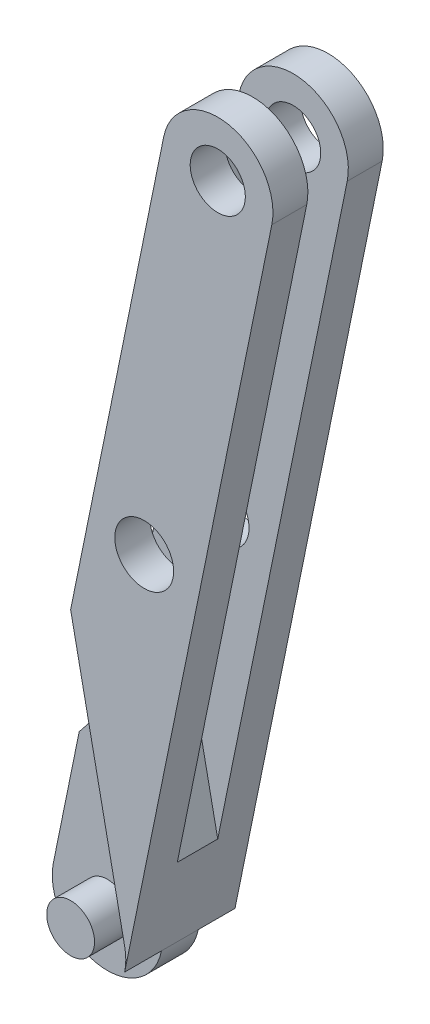
ISO-10303-21;
HEADER;
FILE_DESCRIPTION(('STEP AP214'),'2;1');
FILE_NAME('part.step','',(''),(''),'','','');
FILE_SCHEMA(('AUTOMOTIVE_DESIGN { 1 0 10303 214 1 1 1 1 }'));
ENDSEC;
DATA;
#1=APPLICATION_CONTEXT('core data for automotive mechanical design processes');
#2=APPLICATION_PROTOCOL_DEFINITION('international standard','automotive_design',2000,#1);
#3=PRODUCT_CONTEXT('',#1,'mechanical');
#4=PRODUCT('Part','Part','',(#3));
#5=PRODUCT_RELATED_PRODUCT_CATEGORY('part','',(#4));
#6=PRODUCT_DEFINITION_FORMATION('','',#4);
#7=PRODUCT_DEFINITION_CONTEXT('part definition',#1,'design');
#8=PRODUCT_DEFINITION('design','',#6,#7);
#9=PRODUCT_DEFINITION_SHAPE('','',#8);
#10=(LENGTH_UNIT() NAMED_UNIT(*) SI_UNIT(.MILLI.,.METRE.));
#11=(NAMED_UNIT(*) PLANE_ANGLE_UNIT() SI_UNIT($,.RADIAN.));
#12=(NAMED_UNIT(*) SI_UNIT($,.STERADIAN.) SOLID_ANGLE_UNIT());
#13=UNCERTAINTY_MEASURE_WITH_UNIT(LENGTH_MEASURE(1.E-05),#10,'distance_accuracy_value','');
#14=(GEOMETRIC_REPRESENTATION_CONTEXT(3) GLOBAL_UNCERTAINTY_ASSIGNED_CONTEXT((#13)) GLOBAL_UNIT_ASSIGNED_CONTEXT((#10,
#11,#12)) REPRESENTATION_CONTEXT('',''));
#15=CARTESIAN_POINT('',(0.,0.,0.));
#16=DIRECTION('',(0.,0.,1.));
#17=DIRECTION('',(1.,0.,0.));
#18=AXIS2_PLACEMENT_3D('',#15,#16,#17);
#19=CARTESIAN_POINT('',(5.38354803407322,-0.315439388996806,5.25));
#20=DIRECTION('',(0.979795897113344,-0.199999999999644,0.));
#21=DIRECTION('',(-0.199999999999644,-0.979795897113344,0.));
#22=AXIS2_PLACEMENT_3D('',#19,#20,#21);
#23=PLANE('',#22);
#24=DIRECTION('',(0.,0.,-1.));
#25=VECTOR('',#24,1.);
#26=CARTESIAN_POINT('',(-1.61645196591433,-34.6082957879639,5.25));
#27=LINE('',#26,#25);
#28=CARTESIAN_POINT('',(-1.61645196591434,-34.6082957879638,1.75));
#29=VERTEX_POINT('',#28);
#30=CARTESIAN_POINT('',(-1.61645196591434,-34.6082957879638,-1.75));
#31=VERTEX_POINT('',#30);
#32=EDGE_CURVE('E358',#29,#31,#27,.T.);
#33=ORIENTED_EDGE('',*,*,#32,.T.);
#34=DIRECTION('',(0.,0.,1.));
#35=VECTOR('',#34,1.);
#36=CARTESIAN_POINT('',(-1.61645196591433,-34.6082957879639,-5.25));
#37=LINE('',#36,#35);
#38=CARTESIAN_POINT('',(-1.61645196591433,-34.6082957879639,-5.25));
#39=VERTEX_POINT('',#38);
#40=EDGE_CURVE('E265',#39,#31,#37,.T.);
#41=ORIENTED_EDGE('',*,*,#40,.F.);
#42=DIRECTION('',(0.199999999999644,0.979795897113344,0.));
#43=VECTOR('',#42,1.);
#44=CARTESIAN_POINT('',(5.38354803407322,-0.315439388996806,-5.25));
#45=LINE('',#44,#43);
#46=CARTESIAN_POINT('',(12.3835480340608,33.9774170099702,-5.25));
#47=VERTEX_POINT('',#46);
#48=EDGE_CURVE('E259',#39,#47,#45,.T.);
#49=ORIENTED_EDGE('',*,*,#48,.T.);
#50=DIRECTION('',(0.,0.,1.));
#51=VECTOR('',#50,1.);
#52=CARTESIAN_POINT('',(12.3835480340608,33.9774170099702,-5.25));
#53=LINE('',#52,#51);
#54=CARTESIAN_POINT('',(12.3835480340608,33.9774170099702,-1.925));
#55=VERTEX_POINT('',#54);
#56=EDGE_CURVE('E268',#47,#55,#53,.T.);
#57=ORIENTED_EDGE('',*,*,#56,.T.);
#58=DIRECTION('',(-0.199999999999644,-0.979795897113344,0.));
#59=VECTOR('',#58,1.);
#60=CARTESIAN_POINT('',(5.38354803407322,-0.315439388996806,-1.925));
#61=LINE('',#60,#59);
#62=CARTESIAN_POINT('',(0.0610109471600804,-26.3904393889987,-1.925));
#63=VERTEX_POINT('',#62);
#64=EDGE_CURVE('E232',#55,#63,#61,.T.);
#65=ORIENTED_EDGE('',*,*,#64,.T.);
#66=DIRECTION('',(0.,0.,-1.));
#67=VECTOR('',#66,1.);
#68=CARTESIAN_POINT('',(0.0610109471600792,-26.3904393889987,5.25));
#69=LINE('',#68,#67);
#70=CARTESIAN_POINT('',(0.0610109471600804,-26.3904393889987,1.925));
#71=VERTEX_POINT('',#70);
#72=EDGE_CURVE('E313',#71,#63,#69,.T.);
#73=ORIENTED_EDGE('',*,*,#72,.F.);
#74=DIRECTION('',(-0.199999999999644,-0.979795897113344,0.));
#75=VECTOR('',#74,1.);
#76=CARTESIAN_POINT('',(5.38354803407322,-0.315439388996806,1.925));
#77=LINE('',#76,#75);
#78=CARTESIAN_POINT('',(12.3835480340608,33.9774170099702,1.925));
#79=VERTEX_POINT('',#78);
#80=EDGE_CURVE('E323',#79,#71,#77,.T.);
#81=ORIENTED_EDGE('',*,*,#80,.F.);
#82=DIRECTION('',(0.,0.,-1.));
#83=VECTOR('',#82,1.);
#84=CARTESIAN_POINT('',(12.3835480340608,33.9774170099702,5.25));
#85=LINE('',#84,#83);
#86=CARTESIAN_POINT('',(12.3835480340608,33.9774170099702,5.25));
#87=VERTEX_POINT('',#86);
#88=EDGE_CURVE('E360',#87,#79,#85,.T.);
#89=ORIENTED_EDGE('',*,*,#88,.F.);
#90=DIRECTION('',(0.199999999999644,0.979795897113344,0.));
#91=VECTOR('',#90,1.);
#92=CARTESIAN_POINT('',(5.38354803407322,-0.315439388996806,5.25));
#93=LINE('',#92,#91);
#94=CARTESIAN_POINT('',(-1.61645196591433,-34.6082957879639,5.25));
#95=VERTEX_POINT('',#94);
#96=EDGE_CURVE('E351',#95,#87,#93,.T.);
#97=ORIENTED_EDGE('',*,*,#96,.F.);
#98=EDGE_CURVE('E67',#95,#29,#27,.T.);
#99=ORIENTED_EDGE('',*,*,#98,.T.);
#100=EDGE_LOOP('',(#33,#41,#49,#57,#65,#73,#81,#89,#97,#99));
#101=FACE_BOUND('',#100,.T.);
#102=ADVANCED_FACE('F44',(#101),#23,.T.);
#103=CARTESIAN_POINT('',(-4.90430888561689,1.78456061099946,5.25));
#104=DIRECTION('',(0.979795897113344,-0.199999999999644,0.));
#105=DIRECTION('',(-0.199999999999644,-0.979795897113344,0.));
#106=AXIS2_PLACEMENT_3D('',#103,#104,#105);
#107=PLANE('',#106);
#108=DIRECTION('',(0.,0.,-1.));
#109=VECTOR('',#108,1.);
#110=CARTESIAN_POINT('',(2.09569111437066,36.0774170099665,5.25));
#111=LINE('',#110,#109);
#112=CARTESIAN_POINT('',(2.09569111437067,36.0774170099665,1.925));
#113=VERTEX_POINT('',#112);
#114=CARTESIAN_POINT('',(2.09569111437067,36.0774170099665,-1.925));
#115=VERTEX_POINT('',#114);
#116=EDGE_CURVE('E363',#113,#115,#111,.T.);
#117=ORIENTED_EDGE('',*,*,#116,.T.);
#118=DIRECTION('',(0.,0.,1.));
#119=VECTOR('',#118,1.);
#120=CARTESIAN_POINT('',(2.09569111437066,36.0774170099665,-5.25));
#121=LINE('',#120,#119);
#122=CARTESIAN_POINT('',(2.09569111437066,36.0774170099665,-5.25));
#123=VERTEX_POINT('',#122);
#124=EDGE_CURVE('E271',#123,#115,#121,.T.);
#125=ORIENTED_EDGE('',*,*,#124,.F.);
#126=DIRECTION('',(0.199999999999644,0.979795897113344,0.));
#127=VECTOR('',#126,1.);
#128=CARTESIAN_POINT('',(-4.90430888561689,1.78456061099946,-5.25));
#129=LINE('',#128,#127);
#130=CARTESIAN_POINT('',(-6.7603804257689,-7.30829578796575,-5.25));
#131=VERTEX_POINT('',#130);
#132=EDGE_CURVE('E254',#131,#123,#129,.T.);
#133=ORIENTED_EDGE('',*,*,#132,.F.);
#134=DIRECTION('',(0.,0.,-1.));
#135=VECTOR('',#134,1.);
#136=CARTESIAN_POINT('',(-6.7603804257689,-7.30829578796575,-1.75));
#137=LINE('',#136,#135);
#138=CARTESIAN_POINT('',(-6.76038042576892,-7.30829578796575,-1.925));
#139=VERTEX_POINT('',#138);
#140=EDGE_CURVE('E248',#139,#131,#137,.T.);
#141=ORIENTED_EDGE('',*,*,#140,.F.);
#142=DIRECTION('',(-0.199999999999644,-0.979795897113344,0.));
#143=VECTOR('',#142,1.);
#144=CARTESIAN_POINT('',(-4.90430888561689,1.78456061099946,-1.925));
#145=LINE('',#144,#143);
#146=CARTESIAN_POINT('',(0.418228201296263,27.8595606110014,-1.925));
#147=VERTEX_POINT('',#146);
#148=EDGE_CURVE('E213',#147,#139,#145,.T.);
#149=ORIENTED_EDGE('',*,*,#148,.F.);
#150=DIRECTION('',(0.,0.,1.));
#151=VECTOR('',#150,1.);
#152=CARTESIAN_POINT('',(0.418228201296265,27.8595606110014,5.25));
#153=LINE('',#152,#151);
#154=CARTESIAN_POINT('',(0.418228201296263,27.8595606110014,1.925));
#155=VERTEX_POINT('',#154);
#156=EDGE_CURVE('E367',#147,#155,#153,.T.);
#157=ORIENTED_EDGE('',*,*,#156,.T.);
#158=DIRECTION('',(-0.199999999999644,-0.979795897113344,0.));
#159=VECTOR('',#158,1.);
#160=CARTESIAN_POINT('',(-4.90430888561689,1.78456061099946,1.925));
#161=LINE('',#160,#159);
#162=CARTESIAN_POINT('',(-6.76038042576892,-7.30829578796575,1.925));
#163=VERTEX_POINT('',#162);
#164=EDGE_CURVE('E311',#155,#163,#161,.T.);
#165=ORIENTED_EDGE('',*,*,#164,.T.);
#166=DIRECTION('',(0.,0.,1.));
#167=VECTOR('',#166,1.);
#168=CARTESIAN_POINT('',(-6.7603804257689,-7.30829578796575,1.75));
#169=LINE('',#168,#167);
#170=CARTESIAN_POINT('',(-6.7603804257689,-7.30829578796575,5.25));
#171=VERTEX_POINT('',#170);
#172=EDGE_CURVE('E340',#163,#171,#169,.T.);
#173=ORIENTED_EDGE('',*,*,#172,.T.);
#174=DIRECTION('',(0.199999999999644,0.979795897113344,0.));
#175=VECTOR('',#174,1.);
#176=CARTESIAN_POINT('',(-4.90430888561689,1.78456061099946,5.25));
#177=LINE('',#176,#175);
#178=CARTESIAN_POINT('',(2.09569111437066,36.0774170099665,5.25));
#179=VERTEX_POINT('',#178);
#180=EDGE_CURVE('E346',#171,#179,#177,.T.);
#181=ORIENTED_EDGE('',*,*,#180,.T.);
#182=EDGE_CURVE('E364',#179,#113,#111,.T.);
#183=ORIENTED_EDGE('',*,*,#182,.T.);
#184=EDGE_LOOP('',(#117,#125,#133,#141,#149,#157,#165,#173,#181,#183));
#185=FACE_BOUND('',#184,.T.);
#186=ADVANCED_FACE('F398',(#185),#107,.F.);
#187=CARTESIAN_POINT('',(-6.76038042575937,-33.5582957879657,5.25));
#188=DIRECTION('',(0.,0.,-1.));
#189=DIRECTION('',(-1.,-3.63042929052426E-13,0.));
#190=AXIS2_PLACEMENT_3D('',#187,#188,#189);
#191=CYLINDRICAL_SURFACE('',#190,2.275);
#192=CARTESIAN_POINT('',(-6.76038042575937,-33.5582957879657,1.75));
#193=DIRECTION('',(0.,0.,1.));
#194=DIRECTION('',(1.,3.63042929052426E-13,0.));
#195=AXIS2_PLACEMENT_3D('',#192,#193,#194);
#196=CIRCLE('',#195,2.275);
#197=CARTESIAN_POINT('',(-4.48538042575937,-33.5582957879649,1.75));
#198=VERTEX_POINT('',#197);
#199=EDGE_CURVE('E48',#198,#198,#196,.T.);
#200=ORIENTED_EDGE('',*,*,#199,.T.);
#201=EDGE_LOOP('',(#200));
#202=FACE_BOUND('',#201,.T.);
#203=CARTESIAN_POINT('',(-6.76038042575937,-33.5582957879657,5.25));
#204=DIRECTION('',(0.,0.,1.));
#205=DIRECTION('',(1.,3.63042929052426E-13,0.));
#206=AXIS2_PLACEMENT_3D('',#203,#204,#205);
#207=CIRCLE('',#206,2.275);
#208=CARTESIAN_POINT('',(-4.48538042575937,-33.5582957879649,5.25));
#209=VERTEX_POINT('',#208);
#210=EDGE_CURVE('E11',#209,#209,#207,.T.);
#211=ORIENTED_EDGE('',*,*,#210,.F.);
#212=EDGE_LOOP('',(#211));
#213=FACE_BOUND('',#212,.T.);
#214=ADVANCED_FACE('F376',(#202,#213),#191,.T.);
#215=CARTESIAN_POINT('',(-6.76038042575937,-33.5582957879657,5.25));
#216=DIRECTION('',(0.,0.,1.));
#217=DIRECTION('',(1.,3.63042929052426E-13,0.));
#218=AXIS2_PLACEMENT_3D('',#215,#216,#217);
#219=PLANE('',#218);
#220=ORIENTED_EDGE('',*,*,#210,.T.);
#221=EDGE_LOOP('',(#220));
#222=FACE_BOUND('',#221,.T.);
#223=ADVANCED_FACE('F46',(#222),#219,.T.);
#224=DIRECTION('',(0.,0.,-1.));
#225=VECTOR('',#224,1.);
#226=CARTESIAN_POINT('',(-9.44491534483747,-20.4597772847935,5.25));
#227=LINE('',#226,#225);
#228=CARTESIAN_POINT('',(-9.44491534483748,-20.4597772847935,1.75));
#229=VERTEX_POINT('',#228);
#230=CARTESIAN_POINT('',(-9.44491534483748,-20.4597772847935,-1.75));
#231=VERTEX_POINT('',#230);
#232=EDGE_CURVE('E295',#229,#231,#227,.T.);
#233=ORIENTED_EDGE('',*,*,#232,.T.);
#234=DIRECTION('',(0.199999999999646,0.979795897113344,0.));
#235=VECTOR('',#234,1.);
#236=CARTESIAN_POINT('',(-4.90430888561686,1.78456061099946,-1.75));
#237=LINE('',#236,#235);
#238=CARTESIAN_POINT('',(-11.9043088856044,-32.5082957879676,-1.75));
#239=VERTEX_POINT('',#238);
#240=EDGE_CURVE('E236',#239,#231,#237,.T.);
#241=ORIENTED_EDGE('',*,*,#240,.F.);
#242=DIRECTION('',(0.,0.,-1.));
#243=VECTOR('',#242,1.);
#244=CARTESIAN_POINT('',(-11.9043088856044,-32.5082957879676,5.25));
#245=LINE('',#244,#243);
#246=CARTESIAN_POINT('',(-11.9043088856044,-32.5082957879676,1.75));
#247=VERTEX_POINT('',#246);
#248=EDGE_CURVE('E356',#247,#239,#245,.T.);
#249=ORIENTED_EDGE('',*,*,#248,.F.);
#250=DIRECTION('',(0.199999999999646,0.979795897113344,0.));
#251=VECTOR('',#250,1.);
#252=CARTESIAN_POINT('',(-4.90430888561686,1.78456061099946,1.75));
#253=LINE('',#252,#251);
#254=EDGE_CURVE('E326',#247,#229,#253,.T.);
#255=ORIENTED_EDGE('',*,*,#254,.T.);
#256=EDGE_LOOP('',(#233,#241,#249,#255));
#257=FACE_BOUND('',#256,.T.);
#258=ADVANCED_FACE('F405',(#257),#107,.F.);
#259=CARTESIAN_POINT('',(-6.76038042575937,-33.5582957879657,5.25));
#260=DIRECTION('',(0.,0.,-1.));
#261=DIRECTION('',(1.,3.63042929052426E-13,0.));
#262=AXIS2_PLACEMENT_3D('',#259,#260,#261);
#263=CYLINDRICAL_SURFACE('',#262,5.25);
#264=ORIENTED_EDGE('',*,*,#248,.T.);
#265=CARTESIAN_POINT('',(-6.76038042575938,-33.5582957879657,-1.75));
#266=DIRECTION('',(0.,0.,1.));
#267=DIRECTION('',(1.,3.63042929052426E-13,0.));
#268=AXIS2_PLACEMENT_3D('',#265,#266,#267);
#269=CIRCLE('',#268,5.24999999999999);
#270=EDGE_CURVE('E239',#31,#239,#269,.F.);
#271=ORIENTED_EDGE('',*,*,#270,.F.);
#272=ORIENTED_EDGE('',*,*,#32,.F.);
#273=CARTESIAN_POINT('',(-6.76038042575938,-33.5582957879657,1.75));
#274=DIRECTION('',(0.,0.,1.));
#275=DIRECTION('',(1.,3.63042929052426E-13,0.));
#276=AXIS2_PLACEMENT_3D('',#273,#274,#275);
#277=CIRCLE('',#276,5.24999999999999);
#278=EDGE_CURVE('E329',#29,#247,#277,.F.);
#279=ORIENTED_EDGE('',*,*,#278,.T.);
#280=EDGE_LOOP('',(#264,#271,#272,#279));
#281=FACE_BOUND('',#280,.T.);
#282=ADVANCED_FACE('F408',(#281),#263,.T.);
#283=CARTESIAN_POINT('',(7.23961957421572,35.0274170099684,5.25));
#284=DIRECTION('',(0.,0.,-1.));
#285=DIRECTION('',(1.,3.63042929052426E-13,0.));
#286=AXIS2_PLACEMENT_3D('',#283,#284,#285);
#287=CYLINDRICAL_SURFACE('',#286,5.25);
#288=ORIENTED_EDGE('',*,*,#88,.T.);
#289=CARTESIAN_POINT('',(7.23961957421572,35.0274170099684,1.925));
#290=DIRECTION('',(0.,0.,1.));
#291=DIRECTION('',(1.,3.63042929052426E-13,0.));
#292=AXIS2_PLACEMENT_3D('',#289,#290,#291);
#293=CIRCLE('',#292,5.25);
#294=EDGE_CURVE('E59',#113,#79,#293,.F.);
#295=ORIENTED_EDGE('',*,*,#294,.F.);
#296=ORIENTED_EDGE('',*,*,#182,.F.);
#297=CARTESIAN_POINT('',(7.23961957421572,35.0274170099684,5.25));
#298=DIRECTION('',(0.,0.,-1.));
#299=DIRECTION('',(-1.,-3.63042929052426E-13,0.));
#300=AXIS2_PLACEMENT_3D('',#297,#298,#299);
#301=CIRCLE('',#300,5.25);
#302=EDGE_CURVE('E348',#179,#87,#301,.T.);
#303=ORIENTED_EDGE('',*,*,#302,.T.);
#304=EDGE_LOOP('',(#288,#295,#296,#303));
#305=FACE_BOUND('',#304,.T.);
#306=ADVANCED_FACE('F410',(#305),#287,.T.);
#307=CARTESIAN_POINT('',(0.239619574228164,0.734560611001335,5.25));
#308=DIRECTION('',(0.,0.,-1.));
#309=DIRECTION('',(1.,3.63042929052426E-13,0.));
#310=AXIS2_PLACEMENT_3D('',#307,#308,#309);
#311=CYLINDRICAL_SURFACE('',#310,2.8);
#312=CARTESIAN_POINT('',(0.239619574228164,0.734560611001335,1.925));
#313=DIRECTION('',(0.,0.,1.));
#314=DIRECTION('',(1.,3.63042929052426E-13,0.));
#315=AXIS2_PLACEMENT_3D('',#312,#313,#314);
#316=CIRCLE('',#315,2.8);
#317=CARTESIAN_POINT('',(3.03961957422816,0.734560611002351,1.925));
#318=VERTEX_POINT('',#317);
#319=EDGE_CURVE('E310',#318,#318,#316,.T.);
#320=ORIENTED_EDGE('',*,*,#319,.F.);
#321=EDGE_LOOP('',(#320));
#322=FACE_BOUND('',#321,.T.);
#323=CARTESIAN_POINT('',(0.239619574228164,0.734560611001335,5.25));
#324=DIRECTION('',(0.,0.,-1.));
#325=DIRECTION('',(-1.,-3.63042929052426E-13,0.));
#326=AXIS2_PLACEMENT_3D('',#323,#324,#325);
#327=CIRCLE('',#326,2.8);
#328=CARTESIAN_POINT('',(-2.56038042577184,0.734560611000318,5.25));
#329=VERTEX_POINT('',#328);
#330=EDGE_CURVE('E353',#329,#329,#327,.T.);
#331=ORIENTED_EDGE('',*,*,#330,.F.);
#332=EDGE_LOOP('',(#331));
#333=FACE_BOUND('',#332,.T.);
#334=ADVANCED_FACE('F412',(#322,#333),#311,.F.);
#335=CARTESIAN_POINT('',(7.23961957421572,35.0274170099684,5.25));
#336=DIRECTION('',(0.,0.,-1.));
#337=DIRECTION('',(1.,3.63042929052426E-13,0.));
#338=AXIS2_PLACEMENT_3D('',#335,#336,#337);
#339=CYLINDRICAL_SURFACE('',#338,2.625);
#340=CARTESIAN_POINT('',(7.23961957421572,35.0274170099684,1.925));
#341=DIRECTION('',(0.,0.,1.));
#342=DIRECTION('',(1.,3.63042929052426E-13,0.));
#343=AXIS2_PLACEMENT_3D('',#340,#341,#342);
#344=CIRCLE('',#343,2.625);
#345=CARTESIAN_POINT('',(9.86461957421572,35.0274170099693,1.925));
#346=VERTEX_POINT('',#345);
#347=EDGE_CURVE('E322',#346,#346,#344,.T.);
#348=ORIENTED_EDGE('',*,*,#347,.F.);
#349=EDGE_LOOP('',(#348));
#350=FACE_BOUND('',#349,.T.);
#351=CARTESIAN_POINT('',(7.23961957421572,35.0274170099684,5.25));
#352=DIRECTION('',(0.,0.,-1.));
#353=DIRECTION('',(-1.,-3.63042929052426E-13,0.));
#354=AXIS2_PLACEMENT_3D('',#351,#352,#353);
#355=CIRCLE('',#354,2.625);
#356=CARTESIAN_POINT('',(4.61461957421572,35.0274170099674,5.25));
#357=VERTEX_POINT('',#356);
#358=EDGE_CURVE('E342',#357,#357,#355,.T.);
#359=ORIENTED_EDGE('',*,*,#358,.F.);
#360=EDGE_LOOP('',(#359));
#361=FACE_BOUND('',#360,.T.);
#362=ADVANCED_FACE('F417',(#350,#361),#339,.F.);
#363=CARTESIAN_POINT('',(0.239619574228175,0.734560611001325,5.25));
#364=DIRECTION('',(0.,0.,1.));
#365=DIRECTION('',(-1.,-3.63042929052426E-13,0.));
#366=AXIS2_PLACEMENT_3D('',#363,#364,#365);
#367=PLANE('',#366);
#368=DIRECTION('',(-0.200000000000356,0.979795897113199,0.));
#369=VECTOR('',#368,1.);
#370=CARTESIAN_POINT('',(-8.05645196592655,-0.958867900918854,5.25));
#371=LINE('',#370,#369);
#372=CARTESIAN_POINT('',(-1.61645196591508,-32.5082957879638,5.25));
#373=VERTEX_POINT('',#372);
#374=EDGE_CURVE('E330',#373,#171,#371,.T.);
#375=ORIENTED_EDGE('',*,*,#374,.F.);
#376=CARTESIAN_POINT('',(-6.76038042575938,-33.5582957879657,5.25));
#377=DIRECTION('',(0.,0.,1.));
#378=DIRECTION('',(1.,3.63042929052426E-13,0.));
#379=AXIS2_PLACEMENT_3D('',#376,#377,#378);
#380=CIRCLE('',#379,5.24999999999999);
#381=EDGE_CURVE('E325',#373,#95,#380,.F.);
#382=ORIENTED_EDGE('',*,*,#381,.T.);
#383=ORIENTED_EDGE('',*,*,#96,.T.);
#384=ORIENTED_EDGE('',*,*,#302,.F.);
#385=ORIENTED_EDGE('',*,*,#180,.F.);
#386=EDGE_LOOP('',(#375,#382,#383,#384,#385));
#387=FACE_BOUND('',#386,.T.);
#388=ORIENTED_EDGE('',*,*,#358,.T.);
#389=EDGE_LOOP('',(#388));
#390=FACE_BOUND('',#389,.T.);
#391=ORIENTED_EDGE('',*,*,#330,.T.);
#392=EDGE_LOOP('',(#391));
#393=FACE_BOUND('',#392,.T.);
#394=ADVANCED_FACE('F419',(#387,#390,#393),#367,.T.);
#395=CARTESIAN_POINT('',(-8.05645196592655,-0.958867900918854,1.75));
#396=DIRECTION('',(0.979795897113199,0.200000000000356,0.));
#397=DIRECTION('',(-0.200000000000356,0.979795897113199,0.));
#398=AXIS2_PLACEMENT_3D('',#395,#396,#397);
#399=PLANE('',#398);
#400=DIRECTION('',(0.200000000000356,-0.979795897113199,0.));
#401=VECTOR('',#400,1.);
#402=CARTESIAN_POINT('',(-8.05645196592655,-0.958867900918854,1.925));
#403=LINE('',#402,#401);
#404=CARTESIAN_POINT('',(-5.17344056209303,-15.0826816249269,1.925));
#405=VERTEX_POINT('',#404);
#406=EDGE_CURVE('E301',#163,#405,#403,.T.);
#407=ORIENTED_EDGE('',*,*,#406,.T.);
#408=DIRECTION('',(0.,0.,-1.));
#409=VECTOR('',#408,1.);
#410=CARTESIAN_POINT('',(-5.17344056209302,-15.0826816249269,1.75));
#411=LINE('',#410,#409);
#412=CARTESIAN_POINT('',(-5.17344056209302,-15.0826816249269,1.75));
#413=VERTEX_POINT('',#412);
#414=EDGE_CURVE('E292',#405,#413,#411,.T.);
#415=ORIENTED_EDGE('',*,*,#414,.T.);
#416=DIRECTION('',(-0.200000000000356,0.979795897113199,0.));
#417=VECTOR('',#416,1.);
#418=CARTESIAN_POINT('',(-8.05645196592655,-0.958867900918854,1.75));
#419=LINE('',#418,#417);
#420=CARTESIAN_POINT('',(-1.61645196591508,-32.5082957879638,1.75));
#421=VERTEX_POINT('',#420);
#422=EDGE_CURVE('E333',#421,#413,#419,.T.);
#423=ORIENTED_EDGE('',*,*,#422,.F.);
#424=DIRECTION('',(0.,0.,1.));
#425=VECTOR('',#424,1.);
#426=CARTESIAN_POINT('',(-1.61645196591508,-32.5082957879638,1.75));
#427=LINE('',#426,#425);
#428=EDGE_CURVE('E336',#421,#373,#427,.T.);
#429=ORIENTED_EDGE('',*,*,#428,.T.);
#430=ORIENTED_EDGE('',*,*,#374,.T.);
#431=ORIENTED_EDGE('',*,*,#172,.F.);
#432=EDGE_LOOP('',(#407,#415,#423,#429,#430,#431));
#433=FACE_BOUND('',#432,.T.);
#434=ADVANCED_FACE('F392',(#433),#399,.F.);
#435=CARTESIAN_POINT('',(-6.76038042575938,-33.5582957879657,1.75));
#436=DIRECTION('',(0.,0.,1.));
#437=DIRECTION('',(1.,3.63042929052426E-13,0.));
#438=AXIS2_PLACEMENT_3D('',#435,#436,#437);
#439=CYLINDRICAL_SURFACE('',#438,5.24999999999999);
#440=ORIENTED_EDGE('',*,*,#381,.F.);
#441=ORIENTED_EDGE('',*,*,#428,.F.);
#442=EDGE_CURVE('E331',#421,#29,#277,.F.);
#443=ORIENTED_EDGE('',*,*,#442,.T.);
#444=ORIENTED_EDGE('',*,*,#98,.F.);
#445=EDGE_LOOP('',(#440,#441,#443,#444));
#446=FACE_BOUND('',#445,.T.);
#447=ADVANCED_FACE('F382',(#446),#439,.F.);
#448=CARTESIAN_POINT('',(0.239619574228175,0.734560611001325,1.75));
#449=DIRECTION('',(0.,0.,1.));
#450=DIRECTION('',(1.,3.63042929052426E-13,0.));
#451=AXIS2_PLACEMENT_3D('',#448,#449,#450);
#452=PLANE('',#451);
#453=DIRECTION('',(0.622009680436526,0.78300955131036,0.));
#454=VECTOR('',#453,1.);
#455=CARTESIAN_POINT('',(4.62447306156618,-2.74869359944321,1.75));
#456=LINE('',#455,#454);
#457=EDGE_CURVE('E290',#229,#413,#456,.T.);
#458=ORIENTED_EDGE('',*,*,#457,.F.);
#459=ORIENTED_EDGE('',*,*,#254,.F.);
#460=ORIENTED_EDGE('',*,*,#278,.F.);
#461=ORIENTED_EDGE('',*,*,#442,.F.);
#462=ORIENTED_EDGE('',*,*,#422,.T.);
#463=EDGE_LOOP('',(#458,#459,#460,#461,#462));
#464=FACE_BOUND('',#463,.T.);
#465=ORIENTED_EDGE('',*,*,#199,.F.);
#466=EDGE_LOOP('',(#465));
#467=FACE_BOUND('',#466,.T.);
#468=ADVANCED_FACE('F379',(#464,#467),#452,.T.);
#469=CARTESIAN_POINT('',(0.239619574228175,0.734560611001325,1.925));
#470=DIRECTION('',(0.,0.,1.));
#471=DIRECTION('',(1.,3.63042929052426E-13,0.));
#472=AXIS2_PLACEMENT_3D('',#469,#470,#471);
#473=PLANE('',#472);
#474=ORIENTED_EDGE('',*,*,#347,.T.);
#475=EDGE_LOOP('',(#474));
#476=FACE_BOUND('',#475,.T.);
#477=ORIENTED_EDGE('',*,*,#80,.T.);
#478=DIRECTION('',(0.200000000000356,-0.979795897113199,0.));
#479=VECTOR('',#478,1.);
#480=CARTESIAN_POINT('',(-5.47585649226591,0.73456061099929,1.925));
#481=LINE('',#480,#479);
#482=CARTESIAN_POINT('',(-2.84538969862964,-12.1520422484644,1.925));
#483=VERTEX_POINT('',#482);
#484=EDGE_CURVE('E304',#483,#71,#481,.T.);
#485=ORIENTED_EDGE('',*,*,#484,.F.);
#486=DIRECTION('',(0.622009680436526,0.78300955131036,0.));
#487=VECTOR('',#486,1.);
#488=CARTESIAN_POINT('',(-9.92566591643011,-21.0649644727016,1.925));
#489=LINE('',#488,#487);
#490=EDGE_CURVE('E282',#405,#483,#489,.T.);
#491=ORIENTED_EDGE('',*,*,#490,.F.);
#492=ORIENTED_EDGE('',*,*,#406,.F.);
#493=ORIENTED_EDGE('',*,*,#164,.F.);
#494=DIRECTION('',(-0.200000000000356,0.979795897113199,0.));
#495=VECTOR('',#494,1.);
#496=CARTESIAN_POINT('',(5.95509564072225,0.734560611003425,1.925));
#497=LINE('',#496,#495);
#498=CARTESIAN_POINT('',(3.324628847086,13.6211634704671,1.925));
#499=VERTEX_POINT('',#498);
#500=EDGE_CURVE('E307',#499,#155,#497,.T.);
#501=ORIENTED_EDGE('',*,*,#500,.F.);
#502=DIRECTION('',(-0.622009680436526,-0.78300955131036,0.));
#503=VECTOR('',#502,1.);
#504=CARTESIAN_POINT('',(10.4049050648865,22.5340856947043,1.925));
#505=LINE('',#504,#503);
#506=CARTESIAN_POINT('',(5.65267971054936,16.5518028469296,1.925));
#507=VERTEX_POINT('',#506);
#508=EDGE_CURVE('E286',#507,#499,#505,.T.);
#509=ORIENTED_EDGE('',*,*,#508,.F.);
#510=DIRECTION('',(-0.200000000000355,0.979795897113199,0.));
#511=VECTOR('',#510,1.);
#512=CARTESIAN_POINT('',(8.53569111438287,2.42798912292149,1.925));
#513=LINE('',#512,#511);
#514=CARTESIAN_POINT('',(2.09569111437143,33.9774170099665,1.925));
#515=VERTEX_POINT('',#514);
#516=EDGE_CURVE('E317',#507,#515,#513,.T.);
#517=ORIENTED_EDGE('',*,*,#516,.T.);
#518=EDGE_CURVE('E315',#515,#113,#293,.F.);
#519=ORIENTED_EDGE('',*,*,#518,.T.);
#520=ORIENTED_EDGE('',*,*,#294,.T.);
#521=EDGE_LOOP('',(#477,#485,#491,#492,#493,#501,#509,#517,#519,#520));
#522=FACE_BOUND('',#521,.T.);
#523=ORIENTED_EDGE('',*,*,#319,.T.);
#524=EDGE_LOOP('',(#523));
#525=FACE_BOUND('',#524,.T.);
#526=ADVANCED_FACE('F381',(#476,#522,#525),#473,.F.);
#527=CARTESIAN_POINT('',(8.53569111438287,2.42798912292149,-1.925));
#528=DIRECTION('',(0.979795897113199,0.200000000000355,0.));
#529=DIRECTION('',(-0.200000000000355,0.979795897113199,0.));
#530=AXIS2_PLACEMENT_3D('',#527,#528,#529);
#531=PLANE('',#530);
#532=DIRECTION('',(0.,0.,1.));
#533=VECTOR('',#532,1.);
#534=CARTESIAN_POINT('',(5.65267971054936,16.5518028469296,-1.925));
#535=LINE('',#534,#533);
#536=CARTESIAN_POINT('',(5.65267971054936,16.5518028469296,-1.925));
#537=VERTEX_POINT('',#536);
#538=EDGE_CURVE('E299',#537,#507,#535,.T.);
#539=ORIENTED_EDGE('',*,*,#538,.F.);
#540=DIRECTION('',(-0.200000000000355,0.979795897113199,0.));
#541=VECTOR('',#540,1.);
#542=CARTESIAN_POINT('',(8.53569111438287,2.42798912292149,-1.925));
#543=LINE('',#542,#541);
#544=CARTESIAN_POINT('',(2.09569111437143,33.9774170099665,-1.925));
#545=VERTEX_POINT('',#544);
#546=EDGE_CURVE('E228',#537,#545,#543,.T.);
#547=ORIENTED_EDGE('',*,*,#546,.T.);
#548=DIRECTION('',(0.,0.,1.));
#549=VECTOR('',#548,1.);
#550=CARTESIAN_POINT('',(2.09569111437143,33.9774170099665,-1.925));
#551=LINE('',#550,#549);
#552=EDGE_CURVE('E320',#545,#515,#551,.T.);
#553=ORIENTED_EDGE('',*,*,#552,.T.);
#554=ORIENTED_EDGE('',*,*,#516,.F.);
#555=EDGE_LOOP('',(#539,#547,#553,#554));
#556=FACE_BOUND('',#555,.T.);
#557=ADVANCED_FACE('F389',(#556),#531,.T.);
#558=CARTESIAN_POINT('',(7.23961957421572,35.0274170099684,-1.925));
#559=DIRECTION('',(0.,0.,1.));
#560=DIRECTION('',(1.,3.63042929052426E-13,0.));
#561=AXIS2_PLACEMENT_3D('',#558,#559,#560);
#562=CYLINDRICAL_SURFACE('',#561,5.25);
#563=ORIENTED_EDGE('',*,*,#552,.F.);
#564=CARTESIAN_POINT('',(7.23961957421572,35.0274170099684,-1.925));
#565=DIRECTION('',(0.,0.,1.));
#566=DIRECTION('',(1.,3.63042929052426E-13,0.));
#567=AXIS2_PLACEMENT_3D('',#564,#565,#566);
#568=CIRCLE('',#567,5.25);
#569=EDGE_CURVE('E225',#545,#115,#568,.F.);
#570=ORIENTED_EDGE('',*,*,#569,.T.);
#571=ORIENTED_EDGE('',*,*,#116,.F.);
#572=ORIENTED_EDGE('',*,*,#518,.F.);
#573=EDGE_LOOP('',(#563,#570,#571,#572));
#574=FACE_BOUND('',#573,.T.);
#575=ADVANCED_FACE('F571',(#574),#562,.F.);
#576=CARTESIAN_POINT('',(-5.47585649226591,0.73456061099929,-1.925));
#577=DIRECTION('',(-0.979795897113199,-0.200000000000355,0.));
#578=DIRECTION('',(0.200000000000355,-0.979795897113199,0.));
#579=AXIS2_PLACEMENT_3D('',#576,#577,#578);
#580=PLANE('',#579);
#581=ORIENTED_EDGE('',*,*,#72,.T.);
#582=DIRECTION('',(0.200000000000356,-0.979795897113199,0.));
#583=VECTOR('',#582,1.);
#584=CARTESIAN_POINT('',(-5.47585649226591,0.73456061099929,-1.925));
#585=LINE('',#584,#583);
#586=CARTESIAN_POINT('',(-2.84538969862964,-12.1520422484644,-1.925));
#587=VERTEX_POINT('',#586);
#588=EDGE_CURVE('E215',#587,#63,#585,.T.);
#589=ORIENTED_EDGE('',*,*,#588,.F.);
#590=DIRECTION('',(0.,0.,1.));
#591=VECTOR('',#590,1.);
#592=CARTESIAN_POINT('',(-2.84538969862965,-12.1520422484644,-1.925));
#593=LINE('',#592,#591);
#594=EDGE_CURVE('E191',#587,#483,#593,.T.);
#595=ORIENTED_EDGE('',*,*,#594,.T.);
#596=ORIENTED_EDGE('',*,*,#484,.T.);
#597=EDGE_LOOP('',(#581,#589,#595,#596));
#598=FACE_BOUND('',#597,.T.);
#599=ADVANCED_FACE('F582',(#598),#580,.F.);
#600=CARTESIAN_POINT('',(5.95509564072225,0.734560611003425,-1.925));
#601=DIRECTION('',(0.979795897113199,0.200000000000356,0.));
#602=DIRECTION('',(-0.200000000000356,0.979795897113199,0.));
#603=AXIS2_PLACEMENT_3D('',#600,#601,#602);
#604=PLANE('',#603);
#605=ORIENTED_EDGE('',*,*,#156,.F.);
#606=DIRECTION('',(-0.200000000000356,0.979795897113199,0.));
#607=VECTOR('',#606,1.);
#608=CARTESIAN_POINT('',(5.95509564072225,0.734560611003425,-1.925));
#609=LINE('',#608,#607);
#610=CARTESIAN_POINT('',(3.324628847086,13.6211634704671,-1.925));
#611=VERTEX_POINT('',#610);
#612=EDGE_CURVE('E217',#611,#147,#609,.T.);
#613=ORIENTED_EDGE('',*,*,#612,.F.);
#614=DIRECTION('',(0.,0.,1.));
#615=VECTOR('',#614,1.);
#616=CARTESIAN_POINT('',(3.324628847086,13.6211634704671,-1.925));
#617=LINE('',#616,#615);
#618=EDGE_CURVE('E297',#611,#499,#617,.T.);
#619=ORIENTED_EDGE('',*,*,#618,.T.);
#620=ORIENTED_EDGE('',*,*,#500,.T.);
#621=EDGE_LOOP('',(#605,#613,#619,#620));
#622=FACE_BOUND('',#621,.T.);
#623=ADVANCED_FACE('F593',(#622),#604,.F.);
#624=CARTESIAN_POINT('',(-9.92566591643011,-21.0649644727016,-1.75));
#625=DIRECTION('',(0.78300955131036,-0.622009680436526,0.));
#626=DIRECTION('',(0.622009680436526,0.78300955131036,0.));
#627=AXIS2_PLACEMENT_3D('',#624,#625,#626);
#628=PLANE('',#627);
#629=ORIENTED_EDGE('',*,*,#594,.F.);
#630=DIRECTION('',(0.622009680436526,0.78300955131036,0.));
#631=VECTOR('',#630,1.);
#632=CARTESIAN_POINT('',(-9.92566591643011,-21.0649644727016,-1.925));
#633=LINE('',#632,#631);
#634=CARTESIAN_POINT('',(-5.17344056209303,-15.0826816249269,-1.925));
#635=VERTEX_POINT('',#634);
#636=EDGE_CURVE('E184',#635,#587,#633,.T.);
#637=ORIENTED_EDGE('',*,*,#636,.F.);
#638=DIRECTION('',(0.,0.,1.));
#639=VECTOR('',#638,1.);
#640=CARTESIAN_POINT('',(-5.17344056209302,-15.0826816249269,-1.75));
#641=LINE('',#640,#639);
#642=CARTESIAN_POINT('',(-5.17344056209302,-15.0826816249269,-1.75));
#643=VERTEX_POINT('',#642);
#644=EDGE_CURVE('E188',#635,#643,#641,.T.);
#645=ORIENTED_EDGE('',*,*,#644,.T.);
#646=DIRECTION('',(0.622009680436526,0.78300955131036,0.));
#647=VECTOR('',#646,1.);
#648=CARTESIAN_POINT('',(4.62447306156618,-2.74869359944321,-1.75));
#649=LINE('',#648,#647);
#650=EDGE_CURVE('E206',#231,#643,#649,.T.);
#651=ORIENTED_EDGE('',*,*,#650,.F.);
#652=ORIENTED_EDGE('',*,*,#232,.F.);
#653=ORIENTED_EDGE('',*,*,#457,.T.);
#654=ORIENTED_EDGE('',*,*,#414,.F.);
#655=ORIENTED_EDGE('',*,*,#490,.T.);
#656=EDGE_LOOP('',(#629,#637,#645,#651,#652,#653,#654,#655));
#657=FACE_BOUND('',#656,.T.);
#658=ADVANCED_FACE('F186',(#657),#628,.F.);
#659=CARTESIAN_POINT('',(10.4049050648865,22.5340856947043,-1.75));
#660=DIRECTION('',(-0.78300955131036,0.622009680436526,0.));
#661=DIRECTION('',(-0.622009680436526,-0.78300955131036,0.));
#662=AXIS2_PLACEMENT_3D('',#659,#660,#661);
#663=PLANE('',#662);
#664=ORIENTED_EDGE('',*,*,#618,.F.);
#665=DIRECTION('',(-0.622009680436526,-0.78300955131036,0.));
#666=VECTOR('',#665,1.);
#667=CARTESIAN_POINT('',(10.4049050648865,22.5340856947043,-1.925));
#668=LINE('',#667,#666);
#669=EDGE_CURVE('E196',#537,#611,#668,.T.);
#670=ORIENTED_EDGE('',*,*,#669,.F.);
#671=ORIENTED_EDGE('',*,*,#538,.T.);
#672=ORIENTED_EDGE('',*,*,#508,.T.);
#673=EDGE_LOOP('',(#664,#670,#671,#672));
#674=FACE_BOUND('',#673,.T.);
#675=ADVANCED_FACE('F616',(#674),#663,.F.);
#676=CARTESIAN_POINT('',(-6.76038042575937,-33.5582957879657,-5.25));
#677=DIRECTION('',(0.,0.,1.));
#678=DIRECTION('',(-1.,-3.63042929052426E-13,0.));
#679=AXIS2_PLACEMENT_3D('',#676,#677,#678);
#680=CYLINDRICAL_SURFACE('',#679,2.275);
#681=CARTESIAN_POINT('',(-6.76038042575937,-33.5582957879657,-1.75));
#682=DIRECTION('',(0.,0.,1.));
#683=DIRECTION('',(1.,3.63042929052426E-13,0.));
#684=AXIS2_PLACEMENT_3D('',#681,#682,#683);
#685=CIRCLE('',#684,2.275);
#686=CARTESIAN_POINT('',(-4.48538042575937,-33.5582957879649,-1.75));
#687=VERTEX_POINT('',#686);
#688=EDGE_CURVE('E274',#687,#687,#685,.T.);
#689=ORIENTED_EDGE('',*,*,#688,.F.);
#690=EDGE_LOOP('',(#689));
#691=FACE_BOUND('',#690,.T.);
#692=CARTESIAN_POINT('',(-6.76038042575937,-33.5582957879657,-5.25));
#693=DIRECTION('',(0.,0.,1.));
#694=DIRECTION('',(1.,3.63042929052426E-13,0.));
#695=AXIS2_PLACEMENT_3D('',#692,#693,#694);
#696=CIRCLE('',#695,2.275);
#697=CARTESIAN_POINT('',(-4.48538042575937,-33.5582957879649,-5.25));
#698=VERTEX_POINT('',#697);
#699=EDGE_CURVE('E279',#698,#698,#696,.T.);
#700=ORIENTED_EDGE('',*,*,#699,.T.);
#701=EDGE_LOOP('',(#700));
#702=FACE_BOUND('',#701,.T.);
#703=ADVANCED_FACE('F627',(#691,#702),#680,.T.);
#704=CARTESIAN_POINT('',(-6.76038042575937,-33.5582957879657,-5.25));
#705=DIRECTION('',(0.,0.,-1.));
#706=DIRECTION('',(1.,3.63042929052426E-13,0.));
#707=AXIS2_PLACEMENT_3D('',#704,#705,#706);
#708=PLANE('',#707);
#709=ORIENTED_EDGE('',*,*,#699,.F.);
#710=EDGE_LOOP('',(#709));
#711=FACE_BOUND('',#710,.T.);
#712=ADVANCED_FACE('F638',(#711),#708,.T.);
#713=CARTESIAN_POINT('',(7.23961957421572,35.0274170099684,-5.25));
#714=DIRECTION('',(0.,0.,1.));
#715=DIRECTION('',(1.,3.63042929052426E-13,0.));
#716=AXIS2_PLACEMENT_3D('',#713,#714,#715);
#717=CYLINDRICAL_SURFACE('',#716,5.25);
#718=ORIENTED_EDGE('',*,*,#56,.F.);
#719=CARTESIAN_POINT('',(7.23961957421572,35.0274170099684,-5.25));
#720=DIRECTION('',(0.,0.,-1.));
#721=DIRECTION('',(-1.,-3.63042929052426E-13,0.));
#722=AXIS2_PLACEMENT_3D('',#719,#720,#721);
#723=CIRCLE('',#722,5.25);
#724=EDGE_CURVE('E257',#123,#47,#723,.T.);
#725=ORIENTED_EDGE('',*,*,#724,.F.);
#726=ORIENTED_EDGE('',*,*,#124,.T.);
#727=EDGE_CURVE('E224',#115,#55,#568,.F.);
#728=ORIENTED_EDGE('',*,*,#727,.T.);
#729=EDGE_LOOP('',(#718,#725,#726,#728));
#730=FACE_BOUND('',#729,.T.);
#731=ADVANCED_FACE('F649',(#730),#717,.T.);
#732=CARTESIAN_POINT('',(0.239619574228164,0.734560611001335,-5.25));
#733=DIRECTION('',(0.,0.,1.));
#734=DIRECTION('',(1.,3.63042929052426E-13,0.));
#735=AXIS2_PLACEMENT_3D('',#732,#733,#734);
#736=CYLINDRICAL_SURFACE('',#735,2.8);
#737=CARTESIAN_POINT('',(0.239619574228164,0.734560611001335,-1.925));
#738=DIRECTION('',(0.,0.,1.));
#739=DIRECTION('',(1.,3.63042929052426E-13,0.));
#740=AXIS2_PLACEMENT_3D('',#737,#738,#739);
#741=CIRCLE('',#740,2.8);
#742=CARTESIAN_POINT('',(3.03961957422816,0.734560611002351,-1.925));
#743=VERTEX_POINT('',#742);
#744=EDGE_CURVE('E222',#743,#743,#741,.T.);
#745=ORIENTED_EDGE('',*,*,#744,.T.);
#746=EDGE_LOOP('',(#745));
#747=FACE_BOUND('',#746,.T.);
#748=CARTESIAN_POINT('',(0.239619574228164,0.734560611001335,-5.25));
#749=DIRECTION('',(0.,0.,-1.));
#750=DIRECTION('',(-1.,-3.63042929052426E-13,0.));
#751=AXIS2_PLACEMENT_3D('',#748,#749,#750);
#752=CIRCLE('',#751,2.8);
#753=CARTESIAN_POINT('',(-2.56038042577184,0.734560611000318,-5.25));
#754=VERTEX_POINT('',#753);
#755=EDGE_CURVE('E262',#754,#754,#752,.T.);
#756=ORIENTED_EDGE('',*,*,#755,.T.);
#757=EDGE_LOOP('',(#756));
#758=FACE_BOUND('',#757,.T.);
#759=ADVANCED_FACE('F659',(#747,#758),#736,.F.);
#760=CARTESIAN_POINT('',(7.23961957421572,35.0274170099684,-5.25));
#761=DIRECTION('',(0.,0.,1.));
#762=DIRECTION('',(1.,3.63042929052426E-13,0.));
#763=AXIS2_PLACEMENT_3D('',#760,#761,#762);
#764=CYLINDRICAL_SURFACE('',#763,2.625);
#765=CARTESIAN_POINT('',(7.23961957421572,35.0274170099684,-1.925));
#766=DIRECTION('',(0.,0.,1.));
#767=DIRECTION('',(1.,3.63042929052426E-13,0.));
#768=AXIS2_PLACEMENT_3D('',#765,#766,#767);
#769=CIRCLE('',#768,2.625);
#770=CARTESIAN_POINT('',(9.86461957421572,35.0274170099693,-1.925));
#771=VERTEX_POINT('',#770);
#772=EDGE_CURVE('E231',#771,#771,#769,.T.);
#773=ORIENTED_EDGE('',*,*,#772,.T.);
#774=EDGE_LOOP('',(#773));
#775=FACE_BOUND('',#774,.T.);
#776=CARTESIAN_POINT('',(7.23961957421572,35.0274170099684,-5.25));
#777=DIRECTION('',(0.,0.,-1.));
#778=DIRECTION('',(-1.,-3.63042929052426E-13,0.));
#779=AXIS2_PLACEMENT_3D('',#776,#777,#778);
#780=CIRCLE('',#779,2.625);
#781=CARTESIAN_POINT('',(4.61461957421572,35.0274170099674,-5.25));
#782=VERTEX_POINT('',#781);
#783=EDGE_CURVE('E250',#782,#782,#780,.T.);
#784=ORIENTED_EDGE('',*,*,#783,.T.);
#785=EDGE_LOOP('',(#784));
#786=FACE_BOUND('',#785,.T.);
#787=ADVANCED_FACE('F669',(#775,#786),#764,.F.);
#788=CARTESIAN_POINT('',(0.239619574228175,0.734560611001325,-5.25));
#789=DIRECTION('',(0.,0.,-1.));
#790=DIRECTION('',(-1.,-3.63042929052426E-13,0.));
#791=AXIS2_PLACEMENT_3D('',#788,#789,#790);
#792=PLANE('',#791);
#793=DIRECTION('',(-0.200000000000356,0.979795897113199,0.));
#794=VECTOR('',#793,1.);
#795=CARTESIAN_POINT('',(-8.05645196592655,-0.958867900918854,-5.25));
#796=LINE('',#795,#794);
#797=CARTESIAN_POINT('',(-1.61645196591508,-32.5082957879638,-5.25));
#798=VERTEX_POINT('',#797);
#799=EDGE_CURVE('E240',#798,#131,#796,.T.);
#800=ORIENTED_EDGE('',*,*,#799,.T.);
#801=ORIENTED_EDGE('',*,*,#132,.T.);
#802=ORIENTED_EDGE('',*,*,#724,.T.);
#803=ORIENTED_EDGE('',*,*,#48,.F.);
#804=CARTESIAN_POINT('',(-6.76038042575938,-33.5582957879657,-5.25));
#805=DIRECTION('',(0.,0.,1.));
#806=DIRECTION('',(1.,3.63042929052426E-13,0.));
#807=AXIS2_PLACEMENT_3D('',#804,#805,#806);
#808=CIRCLE('',#807,5.24999999999999);
#809=EDGE_CURVE('E235',#798,#39,#808,.F.);
#810=ORIENTED_EDGE('',*,*,#809,.F.);
#811=EDGE_LOOP('',(#800,#801,#802,#803,#810));
#812=FACE_BOUND('',#811,.T.);
#813=ORIENTED_EDGE('',*,*,#783,.F.);
#814=EDGE_LOOP('',(#813));
#815=FACE_BOUND('',#814,.T.);
#816=ORIENTED_EDGE('',*,*,#755,.F.);
#817=EDGE_LOOP('',(#816));
#818=FACE_BOUND('',#817,.T.);
#819=ADVANCED_FACE('F679',(#812,#815,#818),#792,.T.);
#820=CARTESIAN_POINT('',(-8.05645196592655,-0.958867900918854,-1.75));
#821=DIRECTION('',(0.979795897113199,0.200000000000356,0.));
#822=DIRECTION('',(-0.200000000000356,0.979795897113199,0.));
#823=AXIS2_PLACEMENT_3D('',#820,#821,#822);
#824=PLANE('',#823);
#825=DIRECTION('',(0.200000000000356,-0.979795897113199,0.));
#826=VECTOR('',#825,1.);
#827=CARTESIAN_POINT('',(-8.05645196592655,-0.958867900918854,-1.925));
#828=LINE('',#827,#826);
#829=EDGE_CURVE('E201',#139,#635,#828,.T.);
#830=ORIENTED_EDGE('',*,*,#829,.F.);
#831=ORIENTED_EDGE('',*,*,#140,.T.);
#832=ORIENTED_EDGE('',*,*,#799,.F.);
#833=DIRECTION('',(0.,0.,-1.));
#834=VECTOR('',#833,1.);
#835=CARTESIAN_POINT('',(-1.61645196591508,-32.5082957879638,-1.75));
#836=LINE('',#835,#834);
#837=CARTESIAN_POINT('',(-1.61645196591508,-32.5082957879638,-1.75));
#838=VERTEX_POINT('',#837);
#839=EDGE_CURVE('E245',#838,#798,#836,.T.);
#840=ORIENTED_EDGE('',*,*,#839,.F.);
#841=DIRECTION('',(-0.200000000000356,0.979795897113199,0.));
#842=VECTOR('',#841,1.);
#843=CARTESIAN_POINT('',(-8.05645196592655,-0.958867900918854,-1.75));
#844=LINE('',#843,#842);
#845=EDGE_CURVE('E205',#838,#643,#844,.T.);
#846=ORIENTED_EDGE('',*,*,#845,.T.);
#847=ORIENTED_EDGE('',*,*,#644,.F.);
#848=EDGE_LOOP('',(#830,#831,#832,#840,#846,#847));
#849=FACE_BOUND('',#848,.T.);
#850=ADVANCED_FACE('F199',(#849),#824,.F.);
#851=CARTESIAN_POINT('',(-6.76038042575938,-33.5582957879657,-1.75));
#852=DIRECTION('',(0.,0.,-1.));
#853=DIRECTION('',(1.,3.63042929052426E-13,0.));
#854=AXIS2_PLACEMENT_3D('',#851,#852,#853);
#855=CYLINDRICAL_SURFACE('',#854,5.24999999999999);
#856=ORIENTED_EDGE('',*,*,#809,.T.);
#857=ORIENTED_EDGE('',*,*,#40,.T.);
#858=EDGE_CURVE('E241',#838,#31,#269,.F.);
#859=ORIENTED_EDGE('',*,*,#858,.F.);
#860=ORIENTED_EDGE('',*,*,#839,.T.);
#861=EDGE_LOOP('',(#856,#857,#859,#860));
#862=FACE_BOUND('',#861,.T.);
#863=ADVANCED_FACE('F698',(#862),#855,.F.);
#864=CARTESIAN_POINT('',(0.239619574228175,0.734560611001325,-1.75));
#865=DIRECTION('',(0.,0.,-1.));
#866=DIRECTION('',(1.,3.63042929052426E-13,0.));
#867=AXIS2_PLACEMENT_3D('',#864,#865,#866);
#868=PLANE('',#867);
#869=ORIENTED_EDGE('',*,*,#650,.T.);
#870=ORIENTED_EDGE('',*,*,#845,.F.);
#871=ORIENTED_EDGE('',*,*,#858,.T.);
#872=ORIENTED_EDGE('',*,*,#270,.T.);
#873=ORIENTED_EDGE('',*,*,#240,.T.);
#874=EDGE_LOOP('',(#869,#870,#871,#872,#873));
#875=FACE_BOUND('',#874,.T.);
#876=ORIENTED_EDGE('',*,*,#688,.T.);
#877=EDGE_LOOP('',(#876));
#878=FACE_BOUND('',#877,.T.);
#879=ADVANCED_FACE('F707',(#875,#878),#868,.T.);
#880=CARTESIAN_POINT('',(0.239619574228175,0.734560611001325,-1.925));
#881=DIRECTION('',(0.,0.,-1.));
#882=DIRECTION('',(1.,3.63042929052426E-13,0.));
#883=AXIS2_PLACEMENT_3D('',#880,#881,#882);
#884=PLANE('',#883);
#885=ORIENTED_EDGE('',*,*,#772,.F.);
#886=EDGE_LOOP('',(#885));
#887=FACE_BOUND('',#886,.T.);
#888=ORIENTED_EDGE('',*,*,#64,.F.);
#889=ORIENTED_EDGE('',*,*,#727,.F.);
#890=ORIENTED_EDGE('',*,*,#569,.F.);
#891=ORIENTED_EDGE('',*,*,#546,.F.);
#892=ORIENTED_EDGE('',*,*,#669,.T.);
#893=ORIENTED_EDGE('',*,*,#612,.T.);
#894=ORIENTED_EDGE('',*,*,#148,.T.);
#895=ORIENTED_EDGE('',*,*,#829,.T.);
#896=ORIENTED_EDGE('',*,*,#636,.T.);
#897=ORIENTED_EDGE('',*,*,#588,.T.);
#898=EDGE_LOOP('',(#888,#889,#890,#891,#892,#893,#894,#895,#896,#897));
#899=FACE_BOUND('',#898,.T.);
#900=ORIENTED_EDGE('',*,*,#744,.F.);
#901=EDGE_LOOP('',(#900));
#902=FACE_BOUND('',#901,.T.);
#903=ADVANCED_FACE('F209',(#887,#899,#902),#884,.F.);
#904=CLOSED_SHELL('',(#102,#186,#214,#223,#258,#282,#306,#334,#362,#394,#434,#447,#468,#526,
#557,#575,#599,#623,#658,#675,#703,#712,#731,#759,#787,#819,#850,#863,#879,#903));
#905=MANIFOLD_SOLID_BREP('B2',#904);
#906=ADVANCED_BREP_SHAPE_REPRESENTATION('',(#18,#905),#14);
#907=SHAPE_DEFINITION_REPRESENTATION(#9,#906);
ENDSEC;
END-ISO-10303-21;
